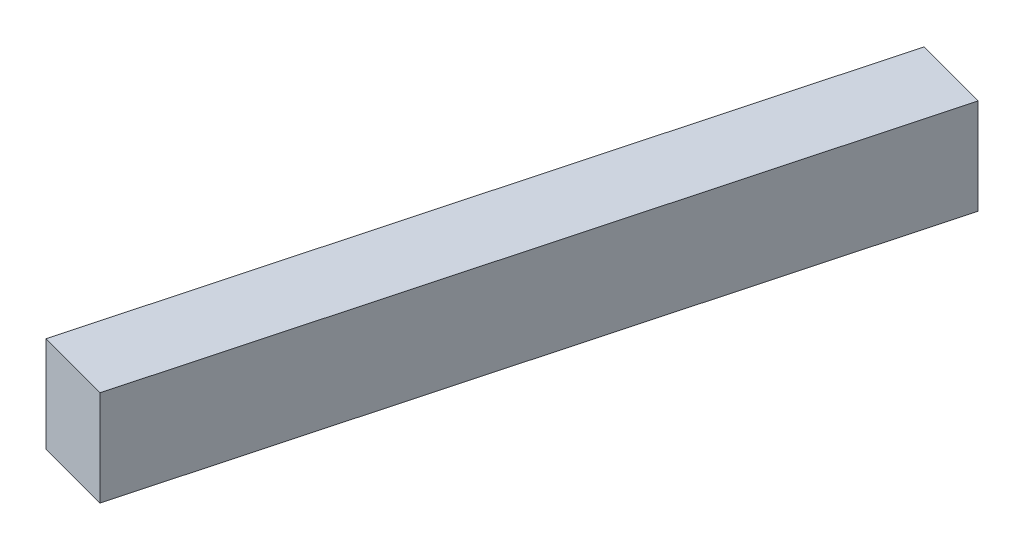
ISO-10303-21;
HEADER;
FILE_DESCRIPTION(('STEP AP214'),'2;1');
FILE_NAME('part.step','',(''),(''),'','','');
FILE_SCHEMA(('AUTOMOTIVE_DESIGN { 1 0 10303 214 1 1 1 1 }'));
ENDSEC;
DATA;
#1=APPLICATION_CONTEXT('core data for automotive mechanical design processes');
#2=APPLICATION_PROTOCOL_DEFINITION('international standard','automotive_design',2000,#1);
#3=PRODUCT_CONTEXT('',#1,'mechanical');
#4=PRODUCT('Part','Part','',(#3));
#5=PRODUCT_RELATED_PRODUCT_CATEGORY('part','',(#4));
#6=PRODUCT_DEFINITION_FORMATION('','',#4);
#7=PRODUCT_DEFINITION_CONTEXT('part definition',#1,'design');
#8=PRODUCT_DEFINITION('design','',#6,#7);
#9=PRODUCT_DEFINITION_SHAPE('','',#8);
#10=(LENGTH_UNIT() NAMED_UNIT(*) SI_UNIT(.MILLI.,.METRE.));
#11=(NAMED_UNIT(*) PLANE_ANGLE_UNIT() SI_UNIT($,.RADIAN.));
#12=(NAMED_UNIT(*) SI_UNIT($,.STERADIAN.) SOLID_ANGLE_UNIT());
#13=UNCERTAINTY_MEASURE_WITH_UNIT(LENGTH_MEASURE(1.E-05),#10,'distance_accuracy_value','');
#14=(GEOMETRIC_REPRESENTATION_CONTEXT(3) GLOBAL_UNCERTAINTY_ASSIGNED_CONTEXT((#13)) GLOBAL_UNIT_ASSIGNED_CONTEXT((#10,
#11,#12)) REPRESENTATION_CONTEXT('',''));
#15=CARTESIAN_POINT('',(0.,0.,0.));
#16=DIRECTION('',(0.,0.,1.));
#17=DIRECTION('',(1.,0.,0.));
#18=AXIS2_PLACEMENT_3D('',#15,#16,#17);
#19=CARTESIAN_POINT('',(4.58342619410499,7.874,-17.4042611027298));
#20=DIRECTION('',(0.965599822106551,0.,0.260032658617713));
#21=DIRECTION('',(0.260032658617713,0.,-0.965599822106551));
#22=AXIS2_PLACEMENT_3D('',#19,#20,#21);
#23=PLANE('',#22);
#24=DIRECTION('',(0.,1.,0.));
#25=VECTOR('',#24,1.);
#26=CARTESIAN_POINT('',(4.58342619410499,7.874,-17.4042611027298));
#27=LINE('',#26,#25);
#28=CARTESIAN_POINT('',(4.58342619410499,7.62,-17.4042611027298));
#29=VERTEX_POINT('',#28);
#30=CARTESIAN_POINT('',(4.58342619410499,7.874,-17.4042611027298));
#31=VERTEX_POINT('',#30);
#32=EDGE_CURVE('E20',#29,#31,#27,.T.);
#33=ORIENTED_EDGE('',*,*,#32,.T.);
#34=DIRECTION('',(-0.260032658617709,0.,0.965599822106553));
#35=VECTOR('',#34,1.);
#36=CARTESIAN_POINT('',(5.07878840877173,7.874,-19.2437287638428));
#37=LINE('',#36,#35);
#38=CARTESIAN_POINT('',(5.07878840877173,7.874,-19.2437287638428));
#39=VERTEX_POINT('',#38);
#40=EDGE_CURVE('E55',#39,#31,#37,.T.);
#41=ORIENTED_EDGE('',*,*,#40,.F.);
#42=DIRECTION('',(0.,1.,0.));
#43=VECTOR('',#42,1.);
#44=CARTESIAN_POINT('',(5.07878840877173,7.874,-19.2437287638428));
#45=LINE('',#44,#43);
#46=CARTESIAN_POINT('',(5.07878840877173,7.62,-19.2437287638428));
#47=VERTEX_POINT('',#46);
#48=EDGE_CURVE('E76',#39,#47,#45,.F.);
#49=ORIENTED_EDGE('',*,*,#48,.T.);
#50=DIRECTION('',(-0.260032658617709,0.,0.965599822106553));
#51=VECTOR('',#50,1.);
#52=CARTESIAN_POINT('',(5.07878840877173,7.62,-19.2437287638428));
#53=LINE('',#52,#51);
#54=EDGE_CURVE('E58',#47,#29,#53,.T.);
#55=ORIENTED_EDGE('',*,*,#54,.T.);
#56=EDGE_LOOP('',(#33,#41,#49,#55));
#57=FACE_BOUND('',#56,.T.);
#58=ADVANCED_FACE('F17',(#57),#23,.F.);
#59=CARTESIAN_POINT('',(4.58342619410499,7.874,-17.4042611027298));
#60=DIRECTION('',(0.260032658617704,0.,-0.965599822106554));
#61=DIRECTION('',(-0.965599822106554,0.,-0.260032658617704));
#62=AXIS2_PLACEMENT_3D('',#59,#60,#61);
#63=PLANE('',#62);
#64=DIRECTION('',(0.,1.,0.));
#65=VECTOR('',#64,1.);
#66=CARTESIAN_POINT('',(4.77963607795704,7.874,-17.3514224664987));
#67=LINE('',#66,#65);
#68=CARTESIAN_POINT('',(4.77963607795704,7.62,-17.3514224664987));
#69=VERTEX_POINT('',#68);
#70=CARTESIAN_POINT('',(4.77963607795704,7.874,-17.3514224664987));
#71=VERTEX_POINT('',#70);
#72=EDGE_CURVE('E73',#69,#71,#67,.T.);
#73=ORIENTED_EDGE('',*,*,#72,.T.);
#74=DIRECTION('',(0.965599822106577,0.,0.26003265861762));
#75=VECTOR('',#74,1.);
#76=CARTESIAN_POINT('',(4.58342619410499,7.874,-17.4042611027298));
#77=LINE('',#76,#75);
#78=EDGE_CURVE('E63',#31,#71,#77,.T.);
#79=ORIENTED_EDGE('',*,*,#78,.F.);
#80=ORIENTED_EDGE('',*,*,#32,.F.);
#81=DIRECTION('',(0.965599822106577,0.,0.26003265861762));
#82=VECTOR('',#81,1.);
#83=CARTESIAN_POINT('',(4.58342619410499,7.62,-17.4042611027298));
#84=LINE('',#83,#82);
#85=EDGE_CURVE('E80',#29,#69,#84,.T.);
#86=ORIENTED_EDGE('',*,*,#85,.T.);
#87=EDGE_LOOP('',(#73,#79,#80,#86));
#88=FACE_BOUND('',#87,.T.);
#89=ADVANCED_FACE('F72',(#88),#63,.F.);
#90=CARTESIAN_POINT('',(4.77963607795704,7.874,-17.3514224664987));
#91=DIRECTION('',(0.,1.,0.));
#92=DIRECTION('',(0.,0.,1.));
#93=AXIS2_PLACEMENT_3D('',#90,#91,#92);
#94=PLANE('',#93);
#95=DIRECTION('',(0.965599822502402,0.,0.26003265714777));
#96=VECTOR('',#95,1.);
#97=CARTESIAN_POINT('',(5.07878840877173,7.874,-19.2437287638428));
#98=LINE('',#97,#96);
#99=CARTESIAN_POINT('',(5.27499829270422,7.874,-19.1908901279104));
#100=VERTEX_POINT('',#99);
#101=EDGE_CURVE('E69',#100,#39,#98,.F.);
#102=ORIENTED_EDGE('',*,*,#101,.T.);
#103=ORIENTED_EDGE('',*,*,#40,.T.);
#104=ORIENTED_EDGE('',*,*,#78,.T.);
#105=DIRECTION('',(-0.260032658617711,0.,0.965599822106552));
#106=VECTOR('',#105,1.);
#107=CARTESIAN_POINT('',(4.77963607795704,7.874,-17.3514224664987));
#108=LINE('',#107,#106);
#109=EDGE_CURVE('E83',#71,#100,#108,.F.);
#110=ORIENTED_EDGE('',*,*,#109,.T.);
#111=EDGE_LOOP('',(#102,#103,#104,#110));
#112=FACE_BOUND('',#111,.T.);
#113=ADVANCED_FACE('F66',(#112),#94,.T.);
#114=CARTESIAN_POINT('',(5.07878840877173,7.874,-19.2437287638428));
#115=DIRECTION('',(-0.26003265714777,0.,0.965599822502402));
#116=DIRECTION('',(0.965599822502402,0.,0.26003265714777));
#117=AXIS2_PLACEMENT_3D('',#114,#115,#116);
#118=PLANE('',#117);
#119=ORIENTED_EDGE('',*,*,#48,.F.);
#120=ORIENTED_EDGE('',*,*,#101,.F.);
#121=DIRECTION('',(0.,1.,0.));
#122=VECTOR('',#121,1.);
#123=CARTESIAN_POINT('',(5.27499829270422,7.874,-19.1908901279104));
#124=LINE('',#123,#122);
#125=CARTESIAN_POINT('',(5.27499829270422,7.62,-19.1908901279104));
#126=VERTEX_POINT('',#125);
#127=EDGE_CURVE('E26',#100,#126,#124,.F.);
#128=ORIENTED_EDGE('',*,*,#127,.T.);
#129=DIRECTION('',(-0.965599822502436,0.,-0.260032657147645));
#130=VECTOR('',#129,1.);
#131=CARTESIAN_POINT('',(5.27499829270422,7.62,-19.1908901279104));
#132=LINE('',#131,#130);
#133=EDGE_CURVE('E34',#126,#47,#132,.T.);
#134=ORIENTED_EDGE('',*,*,#133,.T.);
#135=EDGE_LOOP('',(#119,#120,#128,#134));
#136=FACE_BOUND('',#135,.T.);
#137=ADVANCED_FACE('F88',(#136),#118,.F.);
#138=CARTESIAN_POINT('',(4.77963607795704,7.62,-17.3514224664987));
#139=DIRECTION('',(0.,1.,0.));
#140=DIRECTION('',(0.,0.,1.));
#141=AXIS2_PLACEMENT_3D('',#138,#139,#140);
#142=PLANE('',#141);
#143=ORIENTED_EDGE('',*,*,#54,.F.);
#144=ORIENTED_EDGE('',*,*,#133,.F.);
#145=DIRECTION('',(-0.260032658617711,0.,0.965599822106552));
#146=VECTOR('',#145,1.);
#147=CARTESIAN_POINT('',(4.77963607795704,7.62,-17.3514224664987));
#148=LINE('',#147,#146);
#149=EDGE_CURVE('E11',#126,#69,#148,.T.);
#150=ORIENTED_EDGE('',*,*,#149,.T.);
#151=ORIENTED_EDGE('',*,*,#85,.F.);
#152=EDGE_LOOP('',(#143,#144,#150,#151));
#153=FACE_BOUND('',#152,.T.);
#154=ADVANCED_FACE('F91',(#153),#142,.F.);
#155=CARTESIAN_POINT('',(4.77963607795704,7.874,-17.3514224664987));
#156=DIRECTION('',(-0.965599822106552,0.,-0.260032658617711));
#157=DIRECTION('',(-0.260032658617711,0.,0.965599822106552));
#158=AXIS2_PLACEMENT_3D('',#155,#156,#157);
#159=PLANE('',#158);
#160=ORIENTED_EDGE('',*,*,#127,.F.);
#161=ORIENTED_EDGE('',*,*,#109,.F.);
#162=ORIENTED_EDGE('',*,*,#72,.F.);
#163=ORIENTED_EDGE('',*,*,#149,.F.);
#164=EDGE_LOOP('',(#160,#161,#162,#163));
#165=FACE_BOUND('',#164,.T.);
#166=ADVANCED_FACE('F90',(#165),#159,.F.);
#167=CLOSED_SHELL('',(#58,#89,#113,#137,#154,#166));
#168=MANIFOLD_SOLID_BREP('B1',#167);
#169=ADVANCED_BREP_SHAPE_REPRESENTATION('',(#18,#168),#14);
#170=SHAPE_DEFINITION_REPRESENTATION(#9,#169);
ENDSEC;
END-ISO-10303-21;
